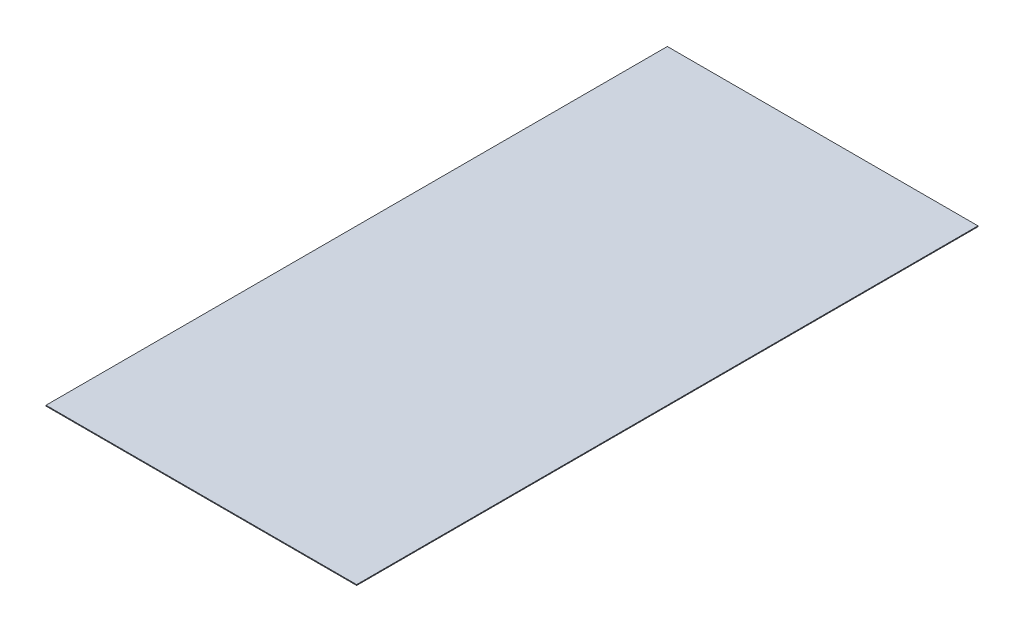
ISO-10303-21;
HEADER;
FILE_DESCRIPTION(('STEP AP214'),'2;1');
FILE_NAME('part.step','',(''),(''),'','','');
FILE_SCHEMA(('AUTOMOTIVE_DESIGN { 1 0 10303 214 1 1 1 1 }'));
ENDSEC;
DATA;
#1=APPLICATION_CONTEXT('core data for automotive mechanical design processes');
#2=APPLICATION_PROTOCOL_DEFINITION('international standard','automotive_design',2000,#1);
#3=PRODUCT_CONTEXT('',#1,'mechanical');
#4=PRODUCT('Part','Part','',(#3));
#5=PRODUCT_RELATED_PRODUCT_CATEGORY('part','',(#4));
#6=PRODUCT_DEFINITION_FORMATION('','',#4);
#7=PRODUCT_DEFINITION_CONTEXT('part definition',#1,'design');
#8=PRODUCT_DEFINITION('design','',#6,#7);
#9=PRODUCT_DEFINITION_SHAPE('','',#8);
#10=(LENGTH_UNIT() NAMED_UNIT(*) SI_UNIT(.MILLI.,.METRE.));
#11=(NAMED_UNIT(*) PLANE_ANGLE_UNIT() SI_UNIT($,.RADIAN.));
#12=(NAMED_UNIT(*) SI_UNIT($,.STERADIAN.) SOLID_ANGLE_UNIT());
#13=UNCERTAINTY_MEASURE_WITH_UNIT(LENGTH_MEASURE(1.E-05),#10,'distance_accuracy_value','');
#14=(GEOMETRIC_REPRESENTATION_CONTEXT(3) GLOBAL_UNCERTAINTY_ASSIGNED_CONTEXT((#13)) GLOBAL_UNIT_ASSIGNED_CONTEXT((#10,
#11,#12)) REPRESENTATION_CONTEXT('',''));
#15=CARTESIAN_POINT('',(0.,0.,0.));
#16=DIRECTION('',(0.,0.,1.));
#17=DIRECTION('',(1.,0.,0.));
#18=AXIS2_PLACEMENT_3D('',#15,#16,#17);
#19=CARTESIAN_POINT('',(609.6,3.2,1219.2));
#20=DIRECTION('',(-1.,0.,0.));
#21=DIRECTION('',(0.,0.,1.));
#22=AXIS2_PLACEMENT_3D('',#19,#20,#21);
#23=PLANE('',#22);
#24=DIRECTION('',(0.,0.,-1.));
#25=VECTOR('',#24,1.);
#26=CARTESIAN_POINT('',(609.6,0.,1219.2));
#27=LINE('',#26,#25);
#28=CARTESIAN_POINT('',(609.6,0.,1219.2));
#29=VERTEX_POINT('',#28);
#30=CARTESIAN_POINT('',(609.6,0.,-1219.2));
#31=VERTEX_POINT('',#30);
#32=EDGE_CURVE('E96',#29,#31,#27,.T.);
#33=ORIENTED_EDGE('',*,*,#32,.T.);
#34=DIRECTION('',(0.,-1.,0.));
#35=VECTOR('',#34,1.);
#36=CARTESIAN_POINT('',(609.6,3.2,-1219.2));
#37=LINE('',#36,#35);
#38=CARTESIAN_POINT('',(609.6,3.2,-1219.2));
#39=VERTEX_POINT('',#38);
#40=EDGE_CURVE('E11',#39,#31,#37,.T.);
#41=ORIENTED_EDGE('',*,*,#40,.F.);
#42=DIRECTION('',(0.,0.,-1.));
#43=VECTOR('',#42,1.);
#44=CARTESIAN_POINT('',(609.6,3.2,1219.2));
#45=LINE('',#44,#43);
#46=CARTESIAN_POINT('',(609.6,3.2,1219.2));
#47=VERTEX_POINT('',#46);
#48=EDGE_CURVE('E84',#47,#39,#45,.T.);
#49=ORIENTED_EDGE('',*,*,#48,.F.);
#50=DIRECTION('',(0.,-1.,0.));
#51=VECTOR('',#50,1.);
#52=CARTESIAN_POINT('',(609.6,3.2,1219.2));
#53=LINE('',#52,#51);
#54=EDGE_CURVE('E92',#47,#29,#53,.T.);
#55=ORIENTED_EDGE('',*,*,#54,.T.);
#56=EDGE_LOOP('',(#33,#41,#49,#55));
#57=FACE_BOUND('',#56,.T.);
#58=ADVANCED_FACE('F33',(#57),#23,.F.);
#59=CARTESIAN_POINT('',(-609.6,3.2,-1219.2));
#60=DIRECTION('',(0.,0.,1.));
#61=DIRECTION('',(1.,0.,0.));
#62=AXIS2_PLACEMENT_3D('',#59,#60,#61);
#63=PLANE('',#62);
#64=DIRECTION('',(-1.,0.,0.));
#65=VECTOR('',#64,1.);
#66=CARTESIAN_POINT('',(-609.6,0.,-1219.2));
#67=LINE('',#66,#65);
#68=CARTESIAN_POINT('',(-609.6,0.,-1219.2));
#69=VERTEX_POINT('',#68);
#70=EDGE_CURVE('E88',#31,#69,#67,.T.);
#71=ORIENTED_EDGE('',*,*,#70,.T.);
#72=DIRECTION('',(0.,-1.,0.));
#73=VECTOR('',#72,1.);
#74=CARTESIAN_POINT('',(-609.6,3.2,-1219.2));
#75=LINE('',#74,#73);
#76=CARTESIAN_POINT('',(-609.6,3.2,-1219.2));
#77=VERTEX_POINT('',#76);
#78=EDGE_CURVE('E41',#77,#69,#75,.T.);
#79=ORIENTED_EDGE('',*,*,#78,.F.);
#80=DIRECTION('',(-1.,0.,0.));
#81=VECTOR('',#80,1.);
#82=CARTESIAN_POINT('',(-609.6,3.2,-1219.2));
#83=LINE('',#82,#81);
#84=EDGE_CURVE('E79',#39,#77,#83,.T.);
#85=ORIENTED_EDGE('',*,*,#84,.F.);
#86=ORIENTED_EDGE('',*,*,#40,.T.);
#87=EDGE_LOOP('',(#71,#79,#85,#86));
#88=FACE_BOUND('',#87,.T.);
#89=ADVANCED_FACE('F87',(#88),#63,.F.);
#90=CARTESIAN_POINT('',(-609.6,3.2,1219.2));
#91=DIRECTION('',(1.,0.,0.));
#92=DIRECTION('',(0.,0.,-1.));
#93=AXIS2_PLACEMENT_3D('',#90,#91,#92);
#94=PLANE('',#93);
#95=DIRECTION('',(0.,0.,1.));
#96=VECTOR('',#95,1.);
#97=CARTESIAN_POINT('',(-609.6,0.,1219.2));
#98=LINE('',#97,#96);
#99=CARTESIAN_POINT('',(-609.6,0.,1219.2));
#100=VERTEX_POINT('',#99);
#101=EDGE_CURVE('E66',#69,#100,#98,.T.);
#102=ORIENTED_EDGE('',*,*,#101,.T.);
#103=DIRECTION('',(0.,-1.,0.));
#104=VECTOR('',#103,1.);
#105=CARTESIAN_POINT('',(-609.6,3.2,1219.2));
#106=LINE('',#105,#104);
#107=CARTESIAN_POINT('',(-609.6,3.2,1219.2));
#108=VERTEX_POINT('',#107);
#109=EDGE_CURVE('E89',#108,#100,#106,.T.);
#110=ORIENTED_EDGE('',*,*,#109,.F.);
#111=DIRECTION('',(0.,0.,1.));
#112=VECTOR('',#111,1.);
#113=CARTESIAN_POINT('',(-609.6,3.2,1219.2));
#114=LINE('',#113,#112);
#115=EDGE_CURVE('E82',#77,#108,#114,.T.);
#116=ORIENTED_EDGE('',*,*,#115,.F.);
#117=ORIENTED_EDGE('',*,*,#78,.T.);
#118=EDGE_LOOP('',(#102,#110,#116,#117));
#119=FACE_BOUND('',#118,.T.);
#120=ADVANCED_FACE('F90',(#119),#94,.F.);
#121=CARTESIAN_POINT('',(-609.6,3.2,1219.2));
#122=DIRECTION('',(0.,0.,-1.));
#123=DIRECTION('',(-1.,0.,0.));
#124=AXIS2_PLACEMENT_3D('',#121,#122,#123);
#125=PLANE('',#124);
#126=DIRECTION('',(1.,0.,0.));
#127=VECTOR('',#126,1.);
#128=CARTESIAN_POINT('',(-609.6,0.,1219.2));
#129=LINE('',#128,#127);
#130=EDGE_CURVE('E72',#100,#29,#129,.T.);
#131=ORIENTED_EDGE('',*,*,#130,.T.);
#132=ORIENTED_EDGE('',*,*,#54,.F.);
#133=DIRECTION('',(1.,0.,0.));
#134=VECTOR('',#133,1.);
#135=CARTESIAN_POINT('',(-609.6,3.2,1219.2));
#136=LINE('',#135,#134);
#137=EDGE_CURVE('E49',#108,#47,#136,.T.);
#138=ORIENTED_EDGE('',*,*,#137,.F.);
#139=ORIENTED_EDGE('',*,*,#109,.T.);
#140=EDGE_LOOP('',(#131,#132,#138,#139));
#141=FACE_BOUND('',#140,.T.);
#142=ADVANCED_FACE('F103',(#141),#125,.F.);
#143=CARTESIAN_POINT('',(0.,3.2,0.));
#144=DIRECTION('',(0.,-1.,0.));
#145=DIRECTION('',(0.,0.,-1.));
#146=AXIS2_PLACEMENT_3D('',#143,#144,#145);
#147=PLANE('',#146);
#148=ORIENTED_EDGE('',*,*,#48,.T.);
#149=ORIENTED_EDGE('',*,*,#84,.T.);
#150=ORIENTED_EDGE('',*,*,#115,.T.);
#151=ORIENTED_EDGE('',*,*,#137,.T.);
#152=EDGE_LOOP('',(#148,#149,#150,#151));
#153=FACE_BOUND('',#152,.T.);
#154=ADVANCED_FACE('F80',(#153),#147,.F.);
#155=CARTESIAN_POINT('',(0.,0.,0.));
#156=DIRECTION('',(0.,-1.,0.));
#157=DIRECTION('',(0.,0.,-1.));
#158=AXIS2_PLACEMENT_3D('',#155,#156,#157);
#159=PLANE('',#158);
#160=ORIENTED_EDGE('',*,*,#32,.F.);
#161=ORIENTED_EDGE('',*,*,#130,.F.);
#162=ORIENTED_EDGE('',*,*,#101,.F.);
#163=ORIENTED_EDGE('',*,*,#70,.F.);
#164=EDGE_LOOP('',(#160,#161,#162,#163));
#165=FACE_BOUND('',#164,.T.);
#166=ADVANCED_FACE('F106',(#165),#159,.T.);
#167=CLOSED_SHELL('',(#58,#89,#120,#142,#154,#166));
#168=MANIFOLD_SOLID_BREP('B2',#167);
#169=ADVANCED_BREP_SHAPE_REPRESENTATION('',(#18,#168),#14);
#170=SHAPE_DEFINITION_REPRESENTATION(#9,#169);
ENDSEC;
END-ISO-10303-21;
